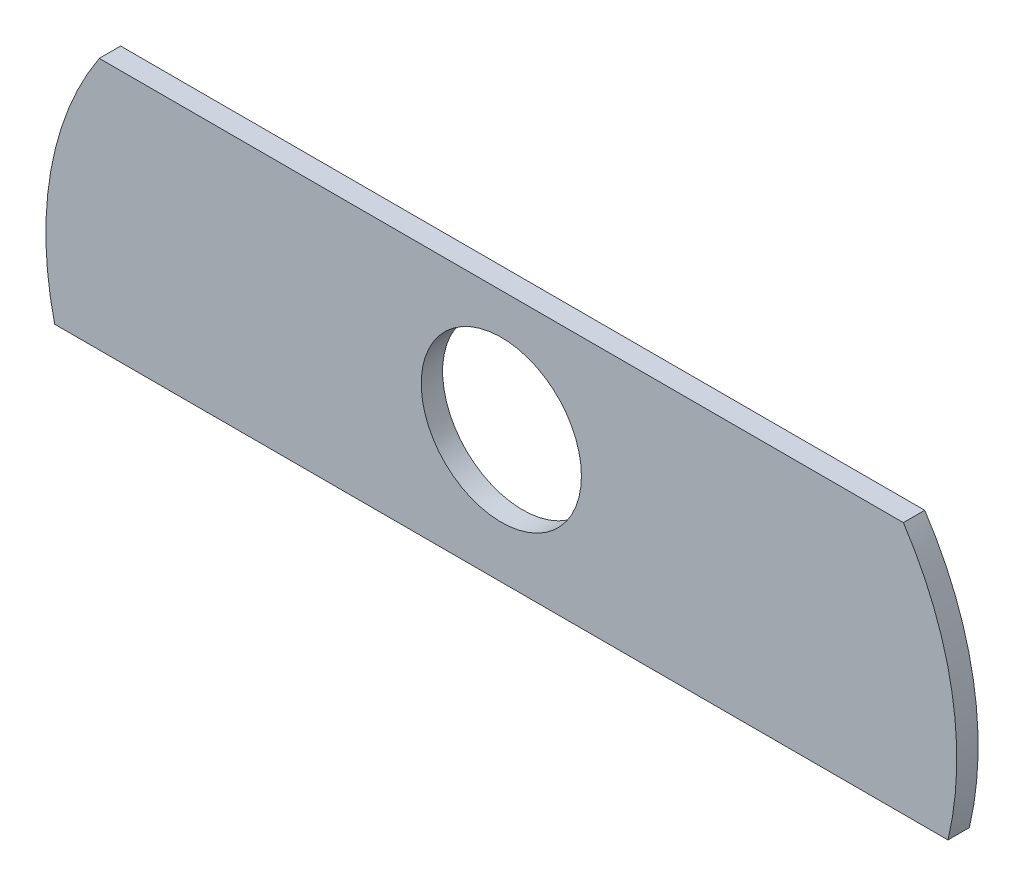
ISO-10303-21;
HEADER;
FILE_DESCRIPTION(('STEP AP214'),'2;1');
FILE_NAME('part.step','',(''),(''),'','','');
FILE_SCHEMA(('AUTOMOTIVE_DESIGN { 1 0 10303 214 1 1 1 1 }'));
ENDSEC;
DATA;
#1=APPLICATION_CONTEXT('core data for automotive mechanical design processes');
#2=APPLICATION_PROTOCOL_DEFINITION('international standard','automotive_design',2000,#1);
#3=PRODUCT_CONTEXT('',#1,'mechanical');
#4=PRODUCT('Part','Part','',(#3));
#5=PRODUCT_RELATED_PRODUCT_CATEGORY('part','',(#4));
#6=PRODUCT_DEFINITION_FORMATION('','',#4);
#7=PRODUCT_DEFINITION_CONTEXT('part definition',#1,'design');
#8=PRODUCT_DEFINITION('design','',#6,#7);
#9=PRODUCT_DEFINITION_SHAPE('','',#8);
#10=(LENGTH_UNIT() NAMED_UNIT(*) SI_UNIT(.MILLI.,.METRE.));
#11=(NAMED_UNIT(*) PLANE_ANGLE_UNIT() SI_UNIT($,.RADIAN.));
#12=(NAMED_UNIT(*) SI_UNIT($,.STERADIAN.) SOLID_ANGLE_UNIT());
#13=UNCERTAINTY_MEASURE_WITH_UNIT(LENGTH_MEASURE(1.E-05),#10,'distance_accuracy_value','');
#14=(GEOMETRIC_REPRESENTATION_CONTEXT(3) GLOBAL_UNCERTAINTY_ASSIGNED_CONTEXT((#13)) GLOBAL_UNIT_ASSIGNED_CONTEXT((#10,
#11,#12)) REPRESENTATION_CONTEXT('',''));
#15=CARTESIAN_POINT('',(0.,0.,0.));
#16=DIRECTION('',(0.,0.,1.));
#17=DIRECTION('',(1.,0.,0.));
#18=AXIS2_PLACEMENT_3D('',#15,#16,#17);
#19=CARTESIAN_POINT('',(-12.46104,0.,2.));
#20=DIRECTION('',(0.,0.,-1.));
#21=DIRECTION('',(-1.,0.,0.));
#22=AXIS2_PLACEMENT_3D('',#19,#20,#21);
#23=CYLINDRICAL_SURFACE('',#22,30.18896);
#24=CARTESIAN_POINT('',(-12.46104,0.,0.));
#25=DIRECTION('',(0.,0.,1.));
#26=DIRECTION('',(1.,0.,0.));
#27=AXIS2_PLACEMENT_3D('',#24,#25,#26);
#28=CIRCLE('',#27,30.18896);
#29=CARTESIAN_POINT('',(-37.65,16.64,0.));
#30=VERTEX_POINT('',#29);
#31=CARTESIAN_POINT('',(-41.8246477886578,-7.01083757588736,0.));
#32=VERTEX_POINT('',#31);
#33=EDGE_CURVE('E107',#30,#32,#28,.T.);
#34=ORIENTED_EDGE('',*,*,#33,.T.);
#35=DIRECTION('',(0.,0.,-1.));
#36=VECTOR('',#35,1.);
#37=CARTESIAN_POINT('',(-41.8246477886578,-7.01083757588736,2.));
#38=LINE('',#37,#36);
#39=CARTESIAN_POINT('',(-41.8246477886578,-7.01083757588736,2.));
#40=VERTEX_POINT('',#39);
#41=EDGE_CURVE('E135',#32,#40,#38,.F.);
#42=ORIENTED_EDGE('',*,*,#41,.T.);
#43=CARTESIAN_POINT('',(-12.46104,0.,2.));
#44=DIRECTION('',(0.,0.,1.));
#45=DIRECTION('',(1.,0.,0.));
#46=AXIS2_PLACEMENT_3D('',#43,#44,#45);
#47=CIRCLE('',#46,30.18896);
#48=CARTESIAN_POINT('',(-37.65,16.64,2.));
#49=VERTEX_POINT('',#48);
#50=EDGE_CURVE('E105',#49,#40,#47,.T.);
#51=ORIENTED_EDGE('',*,*,#50,.F.);
#52=DIRECTION('',(0.,0.,-1.));
#53=VECTOR('',#52,1.);
#54=CARTESIAN_POINT('',(-37.65,16.64,2.));
#55=LINE('',#54,#53);
#56=EDGE_CURVE('E92',#49,#30,#55,.T.);
#57=ORIENTED_EDGE('',*,*,#56,.T.);
#58=EDGE_LOOP('',(#34,#42,#51,#57));
#59=FACE_BOUND('',#58,.T.);
#60=ADVANCED_FACE('F50',(#59),#23,.T.);
#61=CARTESIAN_POINT('',(12.46104,0.,2.));
#62=DIRECTION('',(0.,0.,-1.));
#63=DIRECTION('',(-1.,0.,0.));
#64=AXIS2_PLACEMENT_3D('',#61,#62,#63);
#65=CYLINDRICAL_SURFACE('',#64,30.18896);
#66=CARTESIAN_POINT('',(12.46104,0.,2.));
#67=DIRECTION('',(0.,0.,1.));
#68=DIRECTION('',(-1.,0.,0.));
#69=AXIS2_PLACEMENT_3D('',#66,#67,#68);
#70=CIRCLE('',#69,30.18896);
#71=CARTESIAN_POINT('',(41.8246477886578,-7.01083757588736,2.));
#72=VERTEX_POINT('',#71);
#73=CARTESIAN_POINT('',(37.65,16.64,2.));
#74=VERTEX_POINT('',#73);
#75=EDGE_CURVE('E124',#72,#74,#70,.T.);
#76=ORIENTED_EDGE('',*,*,#75,.F.);
#77=DIRECTION('',(0.,0.,-1.));
#78=VECTOR('',#77,1.);
#79=CARTESIAN_POINT('',(41.8246477886578,-7.01083757588736,2.));
#80=LINE('',#79,#78);
#81=CARTESIAN_POINT('',(41.8246477886578,-7.01083757588736,0.));
#82=VERTEX_POINT('',#81);
#83=EDGE_CURVE('E136',#72,#82,#80,.T.);
#84=ORIENTED_EDGE('',*,*,#83,.T.);
#85=CARTESIAN_POINT('',(12.46104,0.,0.));
#86=DIRECTION('',(0.,0.,1.));
#87=DIRECTION('',(-1.,0.,0.));
#88=AXIS2_PLACEMENT_3D('',#85,#86,#87);
#89=CIRCLE('',#88,30.18896);
#90=CARTESIAN_POINT('',(37.65,16.64,0.));
#91=VERTEX_POINT('',#90);
#92=EDGE_CURVE('E103',#82,#91,#89,.T.);
#93=ORIENTED_EDGE('',*,*,#92,.T.);
#94=DIRECTION('',(0.,0.,-1.));
#95=VECTOR('',#94,1.);
#96=CARTESIAN_POINT('',(37.65,16.64,2.));
#97=LINE('',#96,#95);
#98=EDGE_CURVE('E49',#74,#91,#97,.T.);
#99=ORIENTED_EDGE('',*,*,#98,.F.);
#100=EDGE_LOOP('',(#76,#84,#93,#99));
#101=FACE_BOUND('',#100,.T.);
#102=ADVANCED_FACE('F166',(#101),#65,.T.);
#103=CARTESIAN_POINT('',(-37.65,16.64,2.));
#104=DIRECTION('',(0.,-1.,0.));
#105=DIRECTION('',(1.,0.,0.));
#106=AXIS2_PLACEMENT_3D('',#103,#104,#105);
#107=PLANE('',#106);
#108=DIRECTION('',(-1.,0.,0.));
#109=VECTOR('',#108,1.);
#110=CARTESIAN_POINT('',(-37.65,16.64,0.));
#111=LINE('',#110,#109);
#112=EDGE_CURVE('E95',#91,#30,#111,.T.);
#113=ORIENTED_EDGE('',*,*,#112,.T.);
#114=ORIENTED_EDGE('',*,*,#56,.F.);
#115=DIRECTION('',(-1.,0.,0.));
#116=VECTOR('',#115,1.);
#117=CARTESIAN_POINT('',(-37.65,16.64,2.));
#118=LINE('',#117,#116);
#119=EDGE_CURVE('E77',#74,#49,#118,.T.);
#120=ORIENTED_EDGE('',*,*,#119,.F.);
#121=ORIENTED_EDGE('',*,*,#98,.T.);
#122=EDGE_LOOP('',(#113,#114,#120,#121));
#123=FACE_BOUND('',#122,.T.);
#124=ADVANCED_FACE('F94',(#123),#107,.F.);
#125=CARTESIAN_POINT('',(-12.46104,0.,2.));
#126=DIRECTION('',(0.,0.,1.));
#127=DIRECTION('',(1.,0.,0.));
#128=AXIS2_PLACEMENT_3D('',#125,#126,#127);
#129=PLANE('',#128);
#130=DIRECTION('',(-1.,0.,0.));
#131=VECTOR('',#130,1.);
#132=CARTESIAN_POINT('',(-47.6172323946176,-7.01083757588736,2.));
#133=LINE('',#132,#131);
#134=EDGE_CURVE('E138',#72,#40,#133,.T.);
#135=ORIENTED_EDGE('',*,*,#134,.F.);
#136=ORIENTED_EDGE('',*,*,#75,.T.);
#137=ORIENTED_EDGE('',*,*,#119,.T.);
#138=ORIENTED_EDGE('',*,*,#50,.T.);
#139=EDGE_LOOP('',(#135,#136,#137,#138));
#140=FACE_BOUND('',#139,.T.);
#141=CARTESIAN_POINT('',(0.,5.34,2.));
#142=DIRECTION('',(0.,0.,1.));
#143=DIRECTION('',(1.,0.,0.));
#144=AXIS2_PLACEMENT_3D('',#141,#142,#143);
#145=CIRCLE('',#144,7.5);
#146=CARTESIAN_POINT('',(7.5,5.34,2.));
#147=VERTEX_POINT('',#146);
#148=EDGE_CURVE('E118',#147,#147,#145,.T.);
#149=ORIENTED_EDGE('',*,*,#148,.F.);
#150=EDGE_LOOP('',(#149));
#151=FACE_BOUND('',#150,.T.);
#152=ADVANCED_FACE('F147',(#140,#151),#129,.T.);
#153=CARTESIAN_POINT('',(-12.46104,0.,0.));
#154=DIRECTION('',(0.,0.,1.));
#155=DIRECTION('',(1.,0.,0.));
#156=AXIS2_PLACEMENT_3D('',#153,#154,#155);
#157=PLANE('',#156);
#158=CARTESIAN_POINT('',(0.,5.34,0.));
#159=DIRECTION('',(0.,0.,1.));
#160=DIRECTION('',(1.,0.,0.));
#161=AXIS2_PLACEMENT_3D('',#158,#159,#160);
#162=CIRCLE('',#161,7.5);
#163=CARTESIAN_POINT('',(7.5,5.34,0.));
#164=VERTEX_POINT('',#163);
#165=EDGE_CURVE('E115',#164,#164,#162,.T.);
#166=ORIENTED_EDGE('',*,*,#165,.T.);
#167=EDGE_LOOP('',(#166));
#168=FACE_BOUND('',#167,.T.);
#169=ORIENTED_EDGE('',*,*,#92,.F.);
#170=DIRECTION('',(-1.,0.,0.));
#171=VECTOR('',#170,1.);
#172=CARTESIAN_POINT('',(-47.6172323946176,-7.01083757588736,0.));
#173=LINE('',#172,#171);
#174=EDGE_CURVE('E11',#82,#32,#173,.T.);
#175=ORIENTED_EDGE('',*,*,#174,.T.);
#176=ORIENTED_EDGE('',*,*,#33,.F.);
#177=ORIENTED_EDGE('',*,*,#112,.F.);
#178=EDGE_LOOP('',(#169,#175,#176,#177));
#179=FACE_BOUND('',#178,.T.);
#180=ADVANCED_FACE('F109',(#168,#179),#157,.F.);
#181=CARTESIAN_POINT('',(0.,5.34,0.));
#182=DIRECTION('',(0.,0.,1.));
#183=DIRECTION('',(1.,0.,0.));
#184=AXIS2_PLACEMENT_3D('',#181,#182,#183);
#185=CYLINDRICAL_SURFACE('',#184,7.5);
#186=ORIENTED_EDGE('',*,*,#165,.F.);
#187=EDGE_LOOP('',(#186));
#188=FACE_BOUND('',#187,.T.);
#189=ORIENTED_EDGE('',*,*,#148,.T.);
#190=EDGE_LOOP('',(#189));
#191=FACE_BOUND('',#190,.T.);
#192=ADVANCED_FACE('F156',(#188,#191),#185,.F.);
#193=CARTESIAN_POINT('',(-47.6172323946176,-7.01083757588736,0.));
#194=DIRECTION('',(0.,1.,0.));
#195=DIRECTION('',(0.,0.,1.));
#196=AXIS2_PLACEMENT_3D('',#193,#194,#195);
#197=PLANE('',#196);
#198=ORIENTED_EDGE('',*,*,#174,.F.);
#199=ORIENTED_EDGE('',*,*,#83,.F.);
#200=ORIENTED_EDGE('',*,*,#134,.T.);
#201=ORIENTED_EDGE('',*,*,#41,.F.);
#202=EDGE_LOOP('',(#198,#199,#200,#201));
#203=FACE_BOUND('',#202,.T.);
#204=ADVANCED_FACE('F144',(#203),#197,.F.);
#205=CLOSED_SHELL('',(#60,#102,#124,#152,#180,#192,#204));
#206=MANIFOLD_SOLID_BREP('B2',#205);
#207=ADVANCED_BREP_SHAPE_REPRESENTATION('',(#18,#206),#14);
#208=SHAPE_DEFINITION_REPRESENTATION(#9,#207);
ENDSEC;
END-ISO-10303-21;
